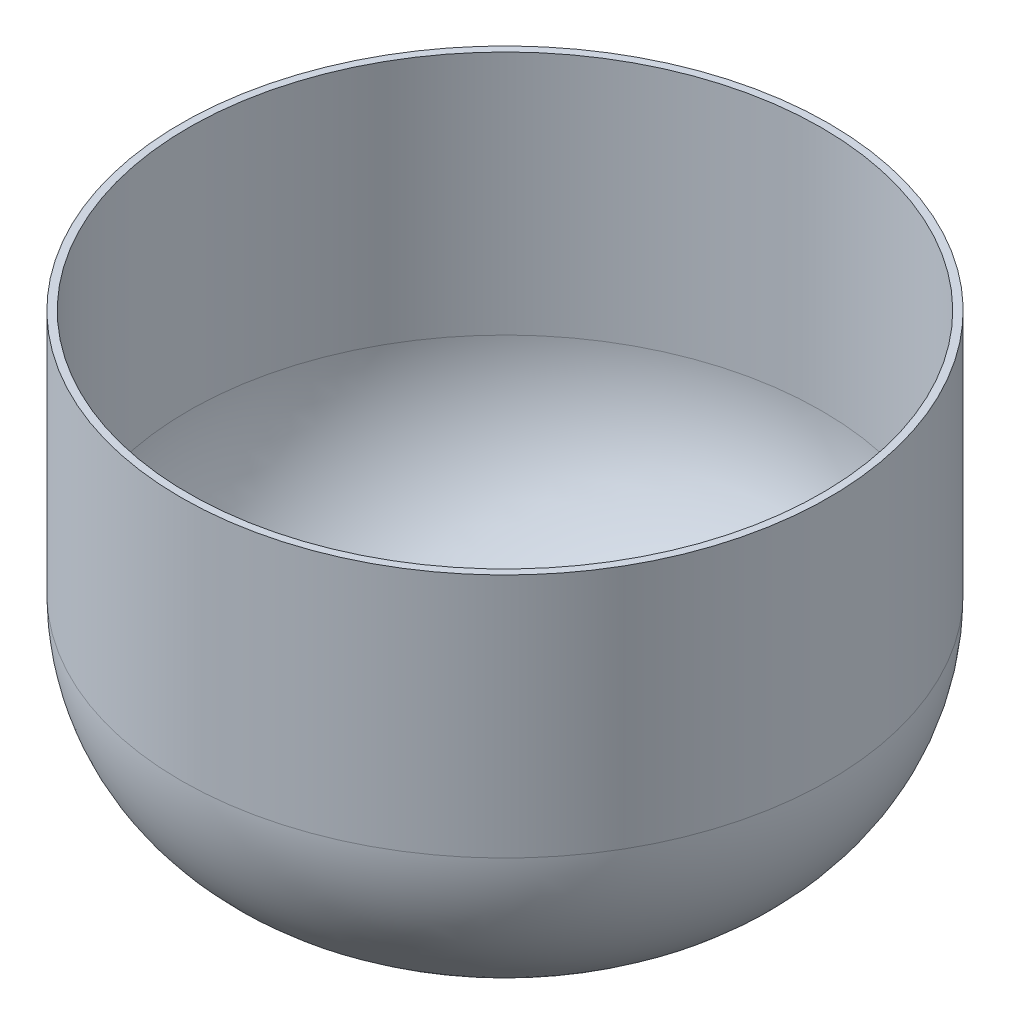
ISO-10303-21;
HEADER;
FILE_DESCRIPTION(('STEP AP214'),'2;1');
FILE_NAME('part.step','',(''),(''),'','','');
FILE_SCHEMA(('AUTOMOTIVE_DESIGN { 1 0 10303 214 1 1 1 1 }'));
ENDSEC;
DATA;
#1=APPLICATION_CONTEXT('core data for automotive mechanical design processes');
#2=APPLICATION_PROTOCOL_DEFINITION('international standard','automotive_design',2000,#1);
#3=PRODUCT_CONTEXT('',#1,'mechanical');
#4=PRODUCT('Part','Part','',(#3));
#5=PRODUCT_RELATED_PRODUCT_CATEGORY('part','',(#4));
#6=PRODUCT_DEFINITION_FORMATION('','',#4);
#7=PRODUCT_DEFINITION_CONTEXT('part definition',#1,'design');
#8=PRODUCT_DEFINITION('design','',#6,#7);
#9=PRODUCT_DEFINITION_SHAPE('','',#8);
#10=(LENGTH_UNIT() NAMED_UNIT(*) SI_UNIT(.MILLI.,.METRE.));
#11=(NAMED_UNIT(*) PLANE_ANGLE_UNIT() SI_UNIT($,.RADIAN.));
#12=(NAMED_UNIT(*) SI_UNIT($,.STERADIAN.) SOLID_ANGLE_UNIT());
#13=UNCERTAINTY_MEASURE_WITH_UNIT(LENGTH_MEASURE(1.E-05),#10,'distance_accuracy_value','');
#14=(GEOMETRIC_REPRESENTATION_CONTEXT(3) GLOBAL_UNCERTAINTY_ASSIGNED_CONTEXT((#13)) GLOBAL_UNIT_ASSIGNED_CONTEXT((#10,
#11,#12)) REPRESENTATION_CONTEXT('',''));
#15=CARTESIAN_POINT('',(0.,0.,0.));
#16=DIRECTION('',(0.,0.,1.));
#17=DIRECTION('',(1.,0.,0.));
#18=AXIS2_PLACEMENT_3D('',#15,#16,#17);
#19=CARTESIAN_POINT('',(-64.5,44.2768450704225,0.));
#20=DIRECTION('',(0.,-1.,0.));
#21=DIRECTION('',(0.,0.,-1.));
#22=AXIS2_PLACEMENT_3D('',#19,#20,#21);
#23=PLANE('',#22);
#24=CARTESIAN_POINT('',(0.,44.2768450704225,0.));
#25=DIRECTION('',(0.,-1.,0.));
#26=DIRECTION('',(0.,0.,-1.));
#27=AXIS2_PLACEMENT_3D('',#24,#25,#26);
#28=CIRCLE('',#27,66.);
#29=CARTESIAN_POINT('',(0.,44.2768450704225,-66.));
#30=VERTEX_POINT('',#29);
#31=EDGE_CURVE('E10',#30,#30,#28,.T.);
#32=ORIENTED_EDGE('',*,*,#31,.F.);
#33=EDGE_LOOP('',(#32));
#34=FACE_BOUND('',#33,.T.);
#35=CARTESIAN_POINT('',(0.,44.2768450704225,0.));
#36=DIRECTION('',(0.,-1.,0.));
#37=DIRECTION('',(0.,0.,-1.));
#38=AXIS2_PLACEMENT_3D('',#35,#36,#37);
#39=CIRCLE('',#38,64.5);
#40=CARTESIAN_POINT('',(0.,44.2768450704225,-64.5));
#41=VERTEX_POINT('',#40);
#42=EDGE_CURVE('E86',#41,#41,#39,.T.);
#43=ORIENTED_EDGE('',*,*,#42,.T.);
#44=EDGE_LOOP('',(#43));
#45=FACE_BOUND('',#44,.T.);
#46=ADVANCED_FACE('F39',(#34,#45),#23,.F.);
#47=CARTESIAN_POINT('',(0.,0.,0.));
#48=DIRECTION('',(0.,-1.,0.));
#49=DIRECTION('',(0.,0.,-1.));
#50=AXIS2_PLACEMENT_3D('',#47,#48,#49);
#51=CYLINDRICAL_SURFACE('',#50,66.);
#52=CARTESIAN_POINT('',(0.,-5.66315492957746,0.));
#53=DIRECTION('',(0.,-1.,0.));
#54=DIRECTION('',(0.,0.,-1.));
#55=AXIS2_PLACEMENT_3D('',#52,#53,#54);
#56=CIRCLE('',#55,66.);
#57=CARTESIAN_POINT('',(0.,-5.66315492957746,-66.));
#58=VERTEX_POINT('',#57);
#59=EDGE_CURVE('E46',#58,#58,#56,.T.);
#60=ORIENTED_EDGE('',*,*,#59,.F.);
#61=EDGE_LOOP('',(#60));
#62=FACE_BOUND('',#61,.T.);
#63=ORIENTED_EDGE('',*,*,#31,.T.);
#64=EDGE_LOOP('',(#63));
#65=FACE_BOUND('',#64,.T.);
#66=ADVANCED_FACE('F142',(#62,#65),#51,.T.);
#67=CARTESIAN_POINT('',(0.,-5.66315492957747,0.));
#68=DIRECTION('',(0.,-1.,0.));
#69=DIRECTION('',(0.,0.,-1.));
#70=AXIS2_PLACEMENT_3D('',#67,#68,#69);
#71=DEGENERATE_TOROIDAL_SURFACE('',#70,25.12,40.88,.T.);
#72=CARTESIAN_POINT('',(0.,-39.1222306926729,0.));
#73=DIRECTION('',(0.,-1.,0.));
#74=DIRECTION('',(0.,0.,-1.));
#75=AXIS2_PLACEMENT_3D('',#72,#73,#74);
#76=CIRCLE('',#75,48.6075424231536);
#77=CARTESIAN_POINT('',(0.,-39.1222306926729,-48.6075424231536));
#78=VERTEX_POINT('',#77);
#79=EDGE_CURVE('E51',#78,#78,#76,.T.);
#80=ORIENTED_EDGE('',*,*,#79,.F.);
#81=EDGE_LOOP('',(#80));
#82=FACE_BOUND('',#81,.T.);
#83=ORIENTED_EDGE('',*,*,#59,.T.);
#84=EDGE_LOOP('',(#83));
#85=FACE_BOUND('',#84,.T.);
#86=ADVANCED_FACE('F137',(#82,#85),#71,.T.);
#87=CARTESIAN_POINT('',(0.,-31.0831549295775,0.));
#88=DIRECTION('',(0.,-1.,0.));
#89=DIRECTION('',(0.,0.,-1.));
#90=AXIS2_PLACEMENT_3D('',#87,#88,#89);
#91=TOROIDAL_SURFACE('',#90,42.66,10.);
#92=CARTESIAN_POINT('',(0.,-41.0831549295775,0.));
#93=DIRECTION('',(0.,-1.,0.));
#94=DIRECTION('',(0.,0.,-1.));
#95=AXIS2_PLACEMENT_3D('',#92,#93,#94);
#96=CIRCLE('',#95,42.66);
#97=CARTESIAN_POINT('',(0.,-41.0831549295775,-42.66));
#98=VERTEX_POINT('',#97);
#99=EDGE_CURVE('E56',#98,#98,#96,.T.);
#100=ORIENTED_EDGE('',*,*,#99,.F.);
#101=EDGE_LOOP('',(#100));
#102=FACE_BOUND('',#101,.T.);
#103=ORIENTED_EDGE('',*,*,#79,.T.);
#104=EDGE_LOOP('',(#103));
#105=FACE_BOUND('',#104,.T.);
#106=ADVANCED_FACE('F131',(#102,#105),#91,.T.);
#107=CARTESIAN_POINT('',(0.,0.,0.));
#108=DIRECTION('',(0.,-1.,0.));
#109=DIRECTION('',(0.,0.,-1.));
#110=AXIS2_PLACEMENT_3D('',#107,#108,#109);
#111=CYLINDRICAL_SURFACE('',#110,42.66);
#112=CARTESIAN_POINT('',(0.,-40.3331549295775,0.));
#113=DIRECTION('',(0.,-1.,0.));
#114=DIRECTION('',(0.,0.,-1.));
#115=AXIS2_PLACEMENT_3D('',#112,#113,#114);
#116=CIRCLE('',#115,42.66);
#117=CARTESIAN_POINT('',(0.,-40.3331549295775,-42.66));
#118=VERTEX_POINT('',#117);
#119=EDGE_CURVE('E62',#118,#118,#116,.T.);
#120=ORIENTED_EDGE('',*,*,#119,.F.);
#121=EDGE_LOOP('',(#120));
#122=FACE_BOUND('',#121,.T.);
#123=ORIENTED_EDGE('',*,*,#99,.T.);
#124=EDGE_LOOP('',(#123));
#125=FACE_BOUND('',#124,.T.);
#126=ADVANCED_FACE('F125',(#122,#125),#111,.F.);
#127=CARTESIAN_POINT('',(-42.66,-40.3331549295775,0.));
#128=DIRECTION('',(0.,1.,0.));
#129=DIRECTION('',(0.,0.,1.));
#130=AXIS2_PLACEMENT_3D('',#127,#128,#129);
#131=PLANE('',#130);
#132=CARTESIAN_POINT('',(0.,-40.3331549295775,0.));
#133=DIRECTION('',(0.,-1.,0.));
#134=DIRECTION('',(0.,0.,-1.));
#135=AXIS2_PLACEMENT_3D('',#132,#133,#134);
#136=CIRCLE('',#135,41.66);
#137=CARTESIAN_POINT('',(0.,-40.3331549295775,-41.66));
#138=VERTEX_POINT('',#137);
#139=EDGE_CURVE('E66',#138,#138,#136,.T.);
#140=ORIENTED_EDGE('',*,*,#139,.F.);
#141=EDGE_LOOP('',(#140));
#142=FACE_BOUND('',#141,.T.);
#143=ORIENTED_EDGE('',*,*,#119,.T.);
#144=EDGE_LOOP('',(#143));
#145=FACE_BOUND('',#144,.T.);
#146=ADVANCED_FACE('F119',(#142,#145),#131,.F.);
#147=CARTESIAN_POINT('',(0.,0.,0.));
#148=DIRECTION('',(0.,-1.,0.));
#149=DIRECTION('',(0.,0.,-1.));
#150=AXIS2_PLACEMENT_3D('',#147,#148,#149);
#151=CYLINDRICAL_SURFACE('',#150,41.66);
#152=CARTESIAN_POINT('',(0.,-39.5831549295775,0.));
#153=DIRECTION('',(0.,-1.,0.));
#154=DIRECTION('',(0.,0.,-1.));
#155=AXIS2_PLACEMENT_3D('',#152,#153,#154);
#156=CIRCLE('',#155,41.66);
#157=CARTESIAN_POINT('',(0.,-39.5831549295775,-41.66));
#158=VERTEX_POINT('',#157);
#159=EDGE_CURVE('E70',#158,#158,#156,.T.);
#160=ORIENTED_EDGE('',*,*,#159,.F.);
#161=EDGE_LOOP('',(#160));
#162=FACE_BOUND('',#161,.T.);
#163=ORIENTED_EDGE('',*,*,#139,.T.);
#164=EDGE_LOOP('',(#163));
#165=FACE_BOUND('',#164,.T.);
#166=ADVANCED_FACE('F113',(#162,#165),#151,.F.);
#167=CARTESIAN_POINT('',(-42.66,-39.5831549295775,0.));
#168=DIRECTION('',(0.,-1.,0.));
#169=DIRECTION('',(0.,0.,-1.));
#170=AXIS2_PLACEMENT_3D('',#167,#168,#169);
#171=PLANE('',#170);
#172=CARTESIAN_POINT('',(0.,-39.5831549295775,0.));
#173=DIRECTION('',(0.,-1.,0.));
#174=DIRECTION('',(0.,0.,-1.));
#175=AXIS2_PLACEMENT_3D('',#172,#173,#174);
#176=CIRCLE('',#175,42.66);
#177=CARTESIAN_POINT('',(0.,-39.5831549295775,-42.66));
#178=VERTEX_POINT('',#177);
#179=EDGE_CURVE('E74',#178,#178,#176,.T.);
#180=ORIENTED_EDGE('',*,*,#179,.F.);
#181=EDGE_LOOP('',(#180));
#182=FACE_BOUND('',#181,.T.);
#183=ORIENTED_EDGE('',*,*,#159,.T.);
#184=EDGE_LOOP('',(#183));
#185=FACE_BOUND('',#184,.T.);
#186=ADVANCED_FACE('F107',(#182,#185),#171,.F.);
#187=CARTESIAN_POINT('',(0.,-31.0831549295775,0.));
#188=DIRECTION('',(0.,-1.,0.));
#189=DIRECTION('',(0.,0.,-1.));
#190=AXIS2_PLACEMENT_3D('',#187,#188,#189);
#191=TOROIDAL_SURFACE('',#190,42.66,8.5);
#192=CARTESIAN_POINT('',(0.,-37.9055902770667,0.));
#193=DIRECTION('',(0.,-1.,0.));
#194=DIRECTION('',(0.,0.,-1.));
#195=AXIS2_PLACEMENT_3D('',#192,#193,#194);
#196=CIRCLE('',#195,47.7299483162385);
#197=CARTESIAN_POINT('',(0.,-37.9055902770667,-47.7299483162385));
#198=VERTEX_POINT('',#197);
#199=EDGE_CURVE('E78',#198,#198,#196,.T.);
#200=ORIENTED_EDGE('',*,*,#199,.F.);
#201=EDGE_LOOP('',(#200));
#202=FACE_BOUND('',#201,.T.);
#203=ORIENTED_EDGE('',*,*,#179,.T.);
#204=EDGE_LOOP('',(#203));
#205=FACE_BOUND('',#204,.T.);
#206=ADVANCED_FACE('F101',(#202,#205),#191,.F.);
#207=CARTESIAN_POINT('',(0.,-5.66315492957747,0.));
#208=DIRECTION('',(0.,-1.,0.));
#209=DIRECTION('',(0.,0.,-1.));
#210=AXIS2_PLACEMENT_3D('',#207,#208,#209);
#211=DEGENERATE_TOROIDAL_SURFACE('',#210,25.12,39.38,.T.);
#212=CARTESIAN_POINT('',(0.,-5.66315492957747,0.));
#213=DIRECTION('',(0.,-1.,0.));
#214=DIRECTION('',(0.,0.,-1.));
#215=AXIS2_PLACEMENT_3D('',#212,#213,#214);
#216=CIRCLE('',#215,64.5);
#217=CARTESIAN_POINT('',(0.,-5.66315492957747,-64.5));
#218=VERTEX_POINT('',#217);
#219=EDGE_CURVE('E82',#218,#218,#216,.T.);
#220=ORIENTED_EDGE('',*,*,#219,.F.);
#221=EDGE_LOOP('',(#220));
#222=FACE_BOUND('',#221,.T.);
#223=ORIENTED_EDGE('',*,*,#199,.T.);
#224=EDGE_LOOP('',(#223));
#225=FACE_BOUND('',#224,.T.);
#226=ADVANCED_FACE('F95',(#222,#225),#211,.F.);
#227=CARTESIAN_POINT('',(0.,0.,0.));
#228=DIRECTION('',(0.,-1.,0.));
#229=DIRECTION('',(0.,0.,-1.));
#230=AXIS2_PLACEMENT_3D('',#227,#228,#229);
#231=CYLINDRICAL_SURFACE('',#230,64.5);
#232=ORIENTED_EDGE('',*,*,#42,.F.);
#233=EDGE_LOOP('',(#232));
#234=FACE_BOUND('',#233,.T.);
#235=ORIENTED_EDGE('',*,*,#219,.T.);
#236=EDGE_LOOP('',(#235));
#237=FACE_BOUND('',#236,.T.);
#238=ADVANCED_FACE('F92',(#234,#237),#231,.F.);
#239=CLOSED_SHELL('',(#46,#66,#86,#106,#126,#146,#166,#186,#206,#226,#238));
#240=MANIFOLD_SOLID_BREP('B2',#239);
#241=ADVANCED_BREP_SHAPE_REPRESENTATION('',(#18,#240),#14);
#242=SHAPE_DEFINITION_REPRESENTATION(#9,#241);
ENDSEC;
END-ISO-10303-21;
